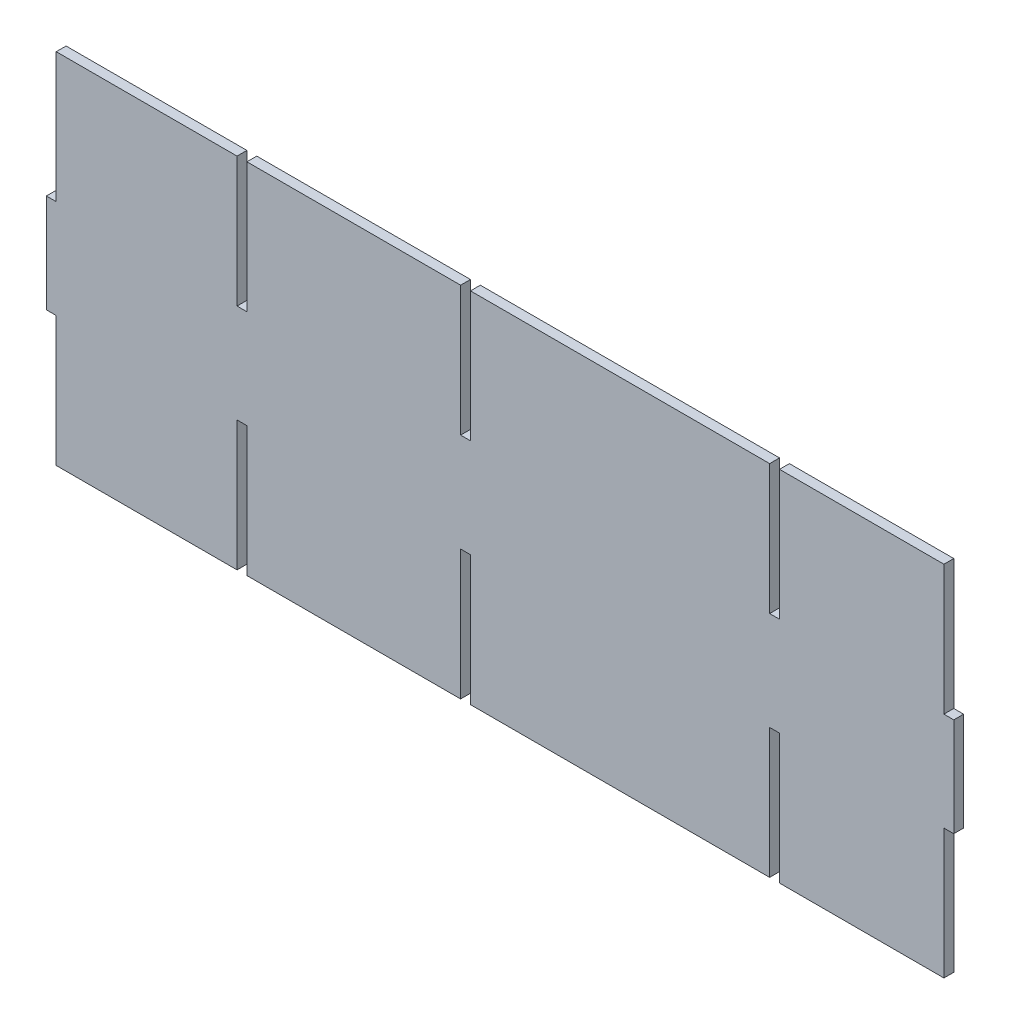
ISO-10303-21;
HEADER;
FILE_DESCRIPTION(('STEP AP214'),'2;1');
FILE_NAME('part.step','',(''),(''),'','','');
FILE_SCHEMA(('AUTOMOTIVE_DESIGN { 1 0 10303 214 1 1 1 1 }'));
ENDSEC;
DATA;
#1=APPLICATION_CONTEXT('core data for automotive mechanical design processes');
#2=APPLICATION_PROTOCOL_DEFINITION('international standard','automotive_design',2000,#1);
#3=PRODUCT_CONTEXT('',#1,'mechanical');
#4=PRODUCT('Part','Part','',(#3));
#5=PRODUCT_RELATED_PRODUCT_CATEGORY('part','',(#4));
#6=PRODUCT_DEFINITION_FORMATION('','',#4);
#7=PRODUCT_DEFINITION_CONTEXT('part definition',#1,'design');
#8=PRODUCT_DEFINITION('design','',#6,#7);
#9=PRODUCT_DEFINITION_SHAPE('','',#8);
#10=(LENGTH_UNIT() NAMED_UNIT(*) SI_UNIT(.MILLI.,.METRE.));
#11=(NAMED_UNIT(*) PLANE_ANGLE_UNIT() SI_UNIT($,.RADIAN.));
#12=(NAMED_UNIT(*) SI_UNIT($,.STERADIAN.) SOLID_ANGLE_UNIT());
#13=UNCERTAINTY_MEASURE_WITH_UNIT(LENGTH_MEASURE(1.E-05),#10,'distance_accuracy_value','');
#14=(GEOMETRIC_REPRESENTATION_CONTEXT(3) GLOBAL_UNCERTAINTY_ASSIGNED_CONTEXT((#13)) GLOBAL_UNIT_ASSIGNED_CONTEXT((#10,
#11,#12)) REPRESENTATION_CONTEXT('',''));
#15=CARTESIAN_POINT('',(0.,0.,0.));
#16=DIRECTION('',(0.,0.,1.));
#17=DIRECTION('',(1.,0.,0.));
#18=AXIS2_PLACEMENT_3D('',#15,#16,#17);
#19=CARTESIAN_POINT('',(0.,30.,3.));
#20=DIRECTION('',(1.,0.,0.));
#21=DIRECTION('',(0.,0.,-1.));
#22=AXIS2_PLACEMENT_3D('',#19,#20,#21);
#23=PLANE('',#22);
#24=DIRECTION('',(0.,-1.,0.));
#25=VECTOR('',#24,1.);
#26=CARTESIAN_POINT('',(0.,30.,0.));
#27=LINE('',#26,#25);
#28=CARTESIAN_POINT('',(0.,30.,0.));
#29=VERTEX_POINT('',#28);
#30=CARTESIAN_POINT('',(0.,0.,0.));
#31=VERTEX_POINT('',#30);
#32=EDGE_CURVE('E301',#29,#31,#27,.T.);
#33=ORIENTED_EDGE('',*,*,#32,.T.);
#34=DIRECTION('',(0.,0.,-1.));
#35=VECTOR('',#34,1.);
#36=CARTESIAN_POINT('',(0.,0.,3.));
#37=LINE('',#36,#35);
#38=CARTESIAN_POINT('',(0.,0.,3.));
#39=VERTEX_POINT('',#38);
#40=EDGE_CURVE('E11',#39,#31,#37,.T.);
#41=ORIENTED_EDGE('',*,*,#40,.F.);
#42=DIRECTION('',(0.,-1.,0.));
#43=VECTOR('',#42,1.);
#44=CARTESIAN_POINT('',(0.,30.,3.));
#45=LINE('',#44,#43);
#46=CARTESIAN_POINT('',(0.,30.,3.));
#47=VERTEX_POINT('',#46);
#48=EDGE_CURVE('E371',#47,#39,#45,.T.);
#49=ORIENTED_EDGE('',*,*,#48,.F.);
#50=DIRECTION('',(0.,0.,-1.));
#51=VECTOR('',#50,1.);
#52=CARTESIAN_POINT('',(0.,30.,3.));
#53=LINE('',#52,#51);
#54=EDGE_CURVE('E297',#47,#29,#53,.T.);
#55=ORIENTED_EDGE('',*,*,#54,.T.);
#56=EDGE_LOOP('',(#33,#41,#49,#55));
#57=FACE_BOUND('',#56,.T.);
#58=ADVANCED_FACE('F37',(#57),#23,.F.);
#59=CARTESIAN_POINT('',(0.,0.,3.));
#60=DIRECTION('',(0.,1.,0.));
#61=DIRECTION('',(0.,0.,1.));
#62=AXIS2_PLACEMENT_3D('',#59,#60,#61);
#63=PLANE('',#62);
#64=DIRECTION('',(1.,0.,0.));
#65=VECTOR('',#64,1.);
#66=CARTESIAN_POINT('',(0.,0.,0.));
#67=LINE('',#66,#65);
#68=CARTESIAN_POINT('',(3.,0.,0.));
#69=VERTEX_POINT('',#68);
#70=EDGE_CURVE('E304',#31,#69,#67,.T.);
#71=ORIENTED_EDGE('',*,*,#70,.T.);
#72=DIRECTION('',(0.,0.,-1.));
#73=VECTOR('',#72,1.);
#74=CARTESIAN_POINT('',(3.,0.,3.));
#75=LINE('',#74,#73);
#76=CARTESIAN_POINT('',(3.,0.,3.));
#77=VERTEX_POINT('',#76);
#78=EDGE_CURVE('E45',#77,#69,#75,.T.);
#79=ORIENTED_EDGE('',*,*,#78,.F.);
#80=DIRECTION('',(1.,0.,0.));
#81=VECTOR('',#80,1.);
#82=CARTESIAN_POINT('',(0.,0.,3.));
#83=LINE('',#82,#81);
#84=EDGE_CURVE('E180',#39,#77,#83,.T.);
#85=ORIENTED_EDGE('',*,*,#84,.F.);
#86=ORIENTED_EDGE('',*,*,#40,.T.);
#87=EDGE_LOOP('',(#71,#79,#85,#86));
#88=FACE_BOUND('',#87,.T.);
#89=ADVANCED_FACE('F569',(#88),#63,.F.);
#90=CARTESIAN_POINT('',(3.,0.,3.));
#91=DIRECTION('',(1.,0.,0.));
#92=DIRECTION('',(0.,1.,0.));
#93=AXIS2_PLACEMENT_3D('',#90,#91,#92);
#94=PLANE('',#93);
#95=DIRECTION('',(0.,-1.,0.));
#96=VECTOR('',#95,1.);
#97=CARTESIAN_POINT('',(3.,0.,0.));
#98=LINE('',#97,#96);
#99=CARTESIAN_POINT('',(3.00000000000001,-39.5,0.));
#100=VERTEX_POINT('',#99);
#101=EDGE_CURVE('E306',#69,#100,#98,.T.);
#102=ORIENTED_EDGE('',*,*,#101,.T.);
#103=DIRECTION('',(0.,0.,-1.));
#104=VECTOR('',#103,1.);
#105=CARTESIAN_POINT('',(3.00000000000001,-39.5,3.));
#106=LINE('',#105,#104);
#107=CARTESIAN_POINT('',(3.00000000000001,-39.5,3.));
#108=VERTEX_POINT('',#107);
#109=EDGE_CURVE('E462',#108,#100,#106,.T.);
#110=ORIENTED_EDGE('',*,*,#109,.F.);
#111=DIRECTION('',(0.,-1.,0.));
#112=VECTOR('',#111,1.);
#113=CARTESIAN_POINT('',(3.,0.,3.));
#114=LINE('',#113,#112);
#115=EDGE_CURVE('E470',#77,#108,#114,.T.);
#116=ORIENTED_EDGE('',*,*,#115,.F.);
#117=ORIENTED_EDGE('',*,*,#78,.T.);
#118=EDGE_LOOP('',(#102,#110,#116,#117));
#119=FACE_BOUND('',#118,.T.);
#120=ADVANCED_FACE('F468',(#119),#94,.F.);
#121=CARTESIAN_POINT('',(3.00000000000001,-39.5,3.));
#122=DIRECTION('',(0.,1.,0.));
#123=DIRECTION('',(0.,0.,1.));
#124=AXIS2_PLACEMENT_3D('',#121,#122,#123);
#125=PLANE('',#124);
#126=DIRECTION('',(1.,0.,0.));
#127=VECTOR('',#126,1.);
#128=CARTESIAN_POINT('',(3.00000000000001,-39.5,0.));
#129=LINE('',#128,#127);
#130=CARTESIAN_POINT('',(58.,-39.5,0.));
#131=VERTEX_POINT('',#130);
#132=EDGE_CURVE('E308',#100,#131,#129,.T.);
#133=ORIENTED_EDGE('',*,*,#132,.T.);
#134=DIRECTION('',(0.,0.,-1.));
#135=VECTOR('',#134,1.);
#136=CARTESIAN_POINT('',(58.,-39.5,3.));
#137=LINE('',#136,#135);
#138=CARTESIAN_POINT('',(58.,-39.5,3.));
#139=VERTEX_POINT('',#138);
#140=EDGE_CURVE('E459',#139,#131,#137,.T.);
#141=ORIENTED_EDGE('',*,*,#140,.F.);
#142=DIRECTION('',(1.,0.,0.));
#143=VECTOR('',#142,1.);
#144=CARTESIAN_POINT('',(3.00000000000001,-39.5,3.));
#145=LINE('',#144,#143);
#146=EDGE_CURVE('E488',#108,#139,#145,.T.);
#147=ORIENTED_EDGE('',*,*,#146,.F.);
#148=ORIENTED_EDGE('',*,*,#109,.T.);
#149=EDGE_LOOP('',(#133,#141,#147,#148));
#150=FACE_BOUND('',#149,.T.);
#151=ADVANCED_FACE('F479',(#150),#125,.F.);
#152=CARTESIAN_POINT('',(58.,-39.5,3.));
#153=DIRECTION('',(-1.,0.,0.));
#154=DIRECTION('',(0.,0.,1.));
#155=AXIS2_PLACEMENT_3D('',#152,#153,#154);
#156=PLANE('',#155);
#157=DIRECTION('',(0.,1.,0.));
#158=VECTOR('',#157,1.);
#159=CARTESIAN_POINT('',(58.,-39.5,0.));
#160=LINE('',#159,#158);
#161=CARTESIAN_POINT('',(58.,0.,0.));
#162=VERTEX_POINT('',#161);
#163=EDGE_CURVE('E310',#131,#162,#160,.T.);
#164=ORIENTED_EDGE('',*,*,#163,.T.);
#165=DIRECTION('',(0.,0.,-1.));
#166=VECTOR('',#165,1.);
#167=CARTESIAN_POINT('',(58.,0.,3.));
#168=LINE('',#167,#166);
#169=CARTESIAN_POINT('',(58.,0.,3.));
#170=VERTEX_POINT('',#169);
#171=EDGE_CURVE('E456',#170,#162,#168,.T.);
#172=ORIENTED_EDGE('',*,*,#171,.F.);
#173=DIRECTION('',(0.,1.,0.));
#174=VECTOR('',#173,1.);
#175=CARTESIAN_POINT('',(58.,-39.5,3.));
#176=LINE('',#175,#174);
#177=EDGE_CURVE('E485',#139,#170,#176,.T.);
#178=ORIENTED_EDGE('',*,*,#177,.F.);
#179=ORIENTED_EDGE('',*,*,#140,.T.);
#180=EDGE_LOOP('',(#164,#172,#178,#179));
#181=FACE_BOUND('',#180,.T.);
#182=ADVANCED_FACE('F483',(#181),#156,.F.);
#183=CARTESIAN_POINT('',(58.,0.,3.));
#184=DIRECTION('',(0.,1.,0.));
#185=DIRECTION('',(0.,0.,1.));
#186=AXIS2_PLACEMENT_3D('',#183,#184,#185);
#187=PLANE('',#186);
#188=DIRECTION('',(1.,0.,0.));
#189=VECTOR('',#188,1.);
#190=CARTESIAN_POINT('',(58.,0.,0.));
#191=LINE('',#190,#189);
#192=CARTESIAN_POINT('',(61.,0.,0.));
#193=VERTEX_POINT('',#192);
#194=EDGE_CURVE('E312',#162,#193,#191,.T.);
#195=ORIENTED_EDGE('',*,*,#194,.T.);
#196=DIRECTION('',(0.,0.,-1.));
#197=VECTOR('',#196,1.);
#198=CARTESIAN_POINT('',(61.,0.,3.));
#199=LINE('',#198,#197);
#200=CARTESIAN_POINT('',(61.,0.,3.));
#201=VERTEX_POINT('',#200);
#202=EDGE_CURVE('E453',#201,#193,#199,.T.);
#203=ORIENTED_EDGE('',*,*,#202,.F.);
#204=DIRECTION('',(1.,0.,0.));
#205=VECTOR('',#204,1.);
#206=CARTESIAN_POINT('',(58.,0.,3.));
#207=LINE('',#206,#205);
#208=EDGE_CURVE('E487',#170,#201,#207,.T.);
#209=ORIENTED_EDGE('',*,*,#208,.F.);
#210=ORIENTED_EDGE('',*,*,#171,.T.);
#211=EDGE_LOOP('',(#195,#203,#209,#210));
#212=FACE_BOUND('',#211,.T.);
#213=ADVANCED_FACE('F582',(#212),#187,.F.);
#214=CARTESIAN_POINT('',(61.,0.,3.));
#215=DIRECTION('',(1.,0.,0.));
#216=DIRECTION('',(0.,1.,0.));
#217=AXIS2_PLACEMENT_3D('',#214,#215,#216);
#218=PLANE('',#217);
#219=DIRECTION('',(0.,-1.,0.));
#220=VECTOR('',#219,1.);
#221=CARTESIAN_POINT('',(61.,0.,0.));
#222=LINE('',#221,#220);
#223=CARTESIAN_POINT('',(61.,-39.5,0.));
#224=VERTEX_POINT('',#223);
#225=EDGE_CURVE('E314',#193,#224,#222,.T.);
#226=ORIENTED_EDGE('',*,*,#225,.T.);
#227=DIRECTION('',(0.,0.,-1.));
#228=VECTOR('',#227,1.);
#229=CARTESIAN_POINT('',(61.,-39.5,3.));
#230=LINE('',#229,#228);
#231=CARTESIAN_POINT('',(61.,-39.5,3.));
#232=VERTEX_POINT('',#231);
#233=EDGE_CURVE('E450',#232,#224,#230,.T.);
#234=ORIENTED_EDGE('',*,*,#233,.F.);
#235=DIRECTION('',(0.,-1.,0.));
#236=VECTOR('',#235,1.);
#237=CARTESIAN_POINT('',(61.,0.,3.));
#238=LINE('',#237,#236);
#239=EDGE_CURVE('E490',#201,#232,#238,.T.);
#240=ORIENTED_EDGE('',*,*,#239,.F.);
#241=ORIENTED_EDGE('',*,*,#202,.T.);
#242=EDGE_LOOP('',(#226,#234,#240,#241));
#243=FACE_BOUND('',#242,.T.);
#244=ADVANCED_FACE('F585',(#243),#218,.F.);
#245=CARTESIAN_POINT('',(61.,-39.5,3.));
#246=DIRECTION('',(0.,1.,0.));
#247=DIRECTION('',(0.,0.,1.));
#248=AXIS2_PLACEMENT_3D('',#245,#246,#247);
#249=PLANE('',#248);
#250=DIRECTION('',(1.,0.,0.));
#251=VECTOR('',#250,1.);
#252=CARTESIAN_POINT('',(61.,-39.5,0.));
#253=LINE('',#252,#251);
#254=CARTESIAN_POINT('',(126.,-39.5,0.));
#255=VERTEX_POINT('',#254);
#256=EDGE_CURVE('E316',#224,#255,#253,.T.);
#257=ORIENTED_EDGE('',*,*,#256,.T.);
#258=DIRECTION('',(0.,0.,-1.));
#259=VECTOR('',#258,1.);
#260=CARTESIAN_POINT('',(126.,-39.5,3.));
#261=LINE('',#260,#259);
#262=CARTESIAN_POINT('',(126.,-39.5,3.));
#263=VERTEX_POINT('',#262);
#264=EDGE_CURVE('E447',#263,#255,#261,.T.);
#265=ORIENTED_EDGE('',*,*,#264,.F.);
#266=DIRECTION('',(1.,0.,0.));
#267=VECTOR('',#266,1.);
#268=CARTESIAN_POINT('',(61.,-39.5,3.));
#269=LINE('',#268,#267);
#270=EDGE_CURVE('E496',#232,#263,#269,.T.);
#271=ORIENTED_EDGE('',*,*,#270,.F.);
#272=ORIENTED_EDGE('',*,*,#233,.T.);
#273=EDGE_LOOP('',(#257,#265,#271,#272));
#274=FACE_BOUND('',#273,.T.);
#275=ADVANCED_FACE('F589',(#274),#249,.F.);
#276=CARTESIAN_POINT('',(126.,-39.5,3.));
#277=DIRECTION('',(-1.,0.,0.));
#278=DIRECTION('',(0.,0.,1.));
#279=AXIS2_PLACEMENT_3D('',#276,#277,#278);
#280=PLANE('',#279);
#281=DIRECTION('',(0.,1.,0.));
#282=VECTOR('',#281,1.);
#283=CARTESIAN_POINT('',(126.,-39.5,0.));
#284=LINE('',#283,#282);
#285=CARTESIAN_POINT('',(126.,0.,0.));
#286=VERTEX_POINT('',#285);
#287=EDGE_CURVE('E318',#255,#286,#284,.T.);
#288=ORIENTED_EDGE('',*,*,#287,.T.);
#289=DIRECTION('',(0.,0.,-1.));
#290=VECTOR('',#289,1.);
#291=CARTESIAN_POINT('',(126.,0.,3.));
#292=LINE('',#291,#290);
#293=CARTESIAN_POINT('',(126.,0.,3.));
#294=VERTEX_POINT('',#293);
#295=EDGE_CURVE('E444',#294,#286,#292,.T.);
#296=ORIENTED_EDGE('',*,*,#295,.F.);
#297=DIRECTION('',(0.,1.,0.));
#298=VECTOR('',#297,1.);
#299=CARTESIAN_POINT('',(126.,-39.5,3.));
#300=LINE('',#299,#298);
#301=EDGE_CURVE('E498',#263,#294,#300,.T.);
#302=ORIENTED_EDGE('',*,*,#301,.F.);
#303=ORIENTED_EDGE('',*,*,#264,.T.);
#304=EDGE_LOOP('',(#288,#296,#302,#303));
#305=FACE_BOUND('',#304,.T.);
#306=ADVANCED_FACE('F593',(#305),#280,.F.);
#307=CARTESIAN_POINT('',(126.,0.,3.));
#308=DIRECTION('',(0.,1.,0.));
#309=DIRECTION('',(0.,0.,1.));
#310=AXIS2_PLACEMENT_3D('',#307,#308,#309);
#311=PLANE('',#310);
#312=DIRECTION('',(1.,0.,0.));
#313=VECTOR('',#312,1.);
#314=CARTESIAN_POINT('',(126.,0.,0.));
#315=LINE('',#314,#313);
#316=CARTESIAN_POINT('',(129.,0.,0.));
#317=VERTEX_POINT('',#316);
#318=EDGE_CURVE('E320',#286,#317,#315,.T.);
#319=ORIENTED_EDGE('',*,*,#318,.T.);
#320=DIRECTION('',(0.,0.,-1.));
#321=VECTOR('',#320,1.);
#322=CARTESIAN_POINT('',(129.,0.,3.));
#323=LINE('',#322,#321);
#324=CARTESIAN_POINT('',(129.,0.,3.));
#325=VERTEX_POINT('',#324);
#326=EDGE_CURVE('E441',#325,#317,#323,.T.);
#327=ORIENTED_EDGE('',*,*,#326,.F.);
#328=DIRECTION('',(1.,0.,0.));
#329=VECTOR('',#328,1.);
#330=CARTESIAN_POINT('',(126.,0.,3.));
#331=LINE('',#330,#329);
#332=EDGE_CURVE('E500',#294,#325,#331,.T.);
#333=ORIENTED_EDGE('',*,*,#332,.F.);
#334=ORIENTED_EDGE('',*,*,#295,.T.);
#335=EDGE_LOOP('',(#319,#327,#333,#334));
#336=FACE_BOUND('',#335,.T.);
#337=ADVANCED_FACE('F597',(#336),#311,.F.);
#338=CARTESIAN_POINT('',(129.,0.,3.));
#339=DIRECTION('',(1.,0.,0.));
#340=DIRECTION('',(0.,0.,-1.));
#341=AXIS2_PLACEMENT_3D('',#338,#339,#340);
#342=PLANE('',#341);
#343=DIRECTION('',(0.,-1.,0.));
#344=VECTOR('',#343,1.);
#345=CARTESIAN_POINT('',(129.,0.,0.));
#346=LINE('',#345,#344);
#347=CARTESIAN_POINT('',(129.,-39.5,0.));
#348=VERTEX_POINT('',#347);
#349=EDGE_CURVE('E322',#317,#348,#346,.T.);
#350=ORIENTED_EDGE('',*,*,#349,.T.);
#351=DIRECTION('',(0.,0.,-1.));
#352=VECTOR('',#351,1.);
#353=CARTESIAN_POINT('',(129.,-39.5,3.));
#354=LINE('',#353,#352);
#355=CARTESIAN_POINT('',(129.,-39.5,3.));
#356=VERTEX_POINT('',#355);
#357=EDGE_CURVE('E438',#356,#348,#354,.T.);
#358=ORIENTED_EDGE('',*,*,#357,.F.);
#359=DIRECTION('',(0.,-1.,0.));
#360=VECTOR('',#359,1.);
#361=CARTESIAN_POINT('',(129.,0.,3.));
#362=LINE('',#361,#360);
#363=EDGE_CURVE('E502',#325,#356,#362,.T.);
#364=ORIENTED_EDGE('',*,*,#363,.F.);
#365=ORIENTED_EDGE('',*,*,#326,.T.);
#366=EDGE_LOOP('',(#350,#358,#364,#365));
#367=FACE_BOUND('',#366,.T.);
#368=ADVANCED_FACE('F601',(#367),#342,.F.);
#369=CARTESIAN_POINT('',(129.,-39.5,3.));
#370=DIRECTION('',(0.,1.,0.));
#371=DIRECTION('',(0.,0.,1.));
#372=AXIS2_PLACEMENT_3D('',#369,#370,#371);
#373=PLANE('',#372);
#374=DIRECTION('',(1.,0.,0.));
#375=VECTOR('',#374,1.);
#376=CARTESIAN_POINT('',(129.,-39.5,0.));
#377=LINE('',#376,#375);
#378=CARTESIAN_POINT('',(220.,-39.5,0.));
#379=VERTEX_POINT('',#378);
#380=EDGE_CURVE('E324',#348,#379,#377,.T.);
#381=ORIENTED_EDGE('',*,*,#380,.T.);
#382=DIRECTION('',(0.,0.,-1.));
#383=VECTOR('',#382,1.);
#384=CARTESIAN_POINT('',(220.,-39.5,3.));
#385=LINE('',#384,#383);
#386=CARTESIAN_POINT('',(220.,-39.5,3.));
#387=VERTEX_POINT('',#386);
#388=EDGE_CURVE('E435',#387,#379,#385,.T.);
#389=ORIENTED_EDGE('',*,*,#388,.F.);
#390=DIRECTION('',(1.,0.,0.));
#391=VECTOR('',#390,1.);
#392=CARTESIAN_POINT('',(129.,-39.5,3.));
#393=LINE('',#392,#391);
#394=EDGE_CURVE('E504',#356,#387,#393,.T.);
#395=ORIENTED_EDGE('',*,*,#394,.F.);
#396=ORIENTED_EDGE('',*,*,#357,.T.);
#397=EDGE_LOOP('',(#381,#389,#395,#396));
#398=FACE_BOUND('',#397,.T.);
#399=ADVANCED_FACE('F605',(#398),#373,.F.);
#400=CARTESIAN_POINT('',(220.,-39.5,3.));
#401=DIRECTION('',(-1.,0.,0.));
#402=DIRECTION('',(0.,0.,1.));
#403=AXIS2_PLACEMENT_3D('',#400,#401,#402);
#404=PLANE('',#403);
#405=DIRECTION('',(0.,1.,0.));
#406=VECTOR('',#405,1.);
#407=CARTESIAN_POINT('',(220.,-39.5,0.));
#408=LINE('',#407,#406);
#409=CARTESIAN_POINT('',(220.,0.,0.));
#410=VERTEX_POINT('',#409);
#411=EDGE_CURVE('E326',#379,#410,#408,.T.);
#412=ORIENTED_EDGE('',*,*,#411,.T.);
#413=DIRECTION('',(0.,0.,-1.));
#414=VECTOR('',#413,1.);
#415=CARTESIAN_POINT('',(220.,0.,3.));
#416=LINE('',#415,#414);
#417=CARTESIAN_POINT('',(220.,0.,3.));
#418=VERTEX_POINT('',#417);
#419=EDGE_CURVE('E432',#418,#410,#416,.T.);
#420=ORIENTED_EDGE('',*,*,#419,.F.);
#421=DIRECTION('',(0.,1.,0.));
#422=VECTOR('',#421,1.);
#423=CARTESIAN_POINT('',(220.,-39.5,3.));
#424=LINE('',#423,#422);
#425=EDGE_CURVE('E506',#387,#418,#424,.T.);
#426=ORIENTED_EDGE('',*,*,#425,.F.);
#427=ORIENTED_EDGE('',*,*,#388,.T.);
#428=EDGE_LOOP('',(#412,#420,#426,#427));
#429=FACE_BOUND('',#428,.T.);
#430=ADVANCED_FACE('F609',(#429),#404,.F.);
#431=CARTESIAN_POINT('',(220.,0.,3.));
#432=DIRECTION('',(0.,1.,0.));
#433=DIRECTION('',(0.,0.,1.));
#434=AXIS2_PLACEMENT_3D('',#431,#432,#433);
#435=PLANE('',#434);
#436=DIRECTION('',(1.,0.,0.));
#437=VECTOR('',#436,1.);
#438=CARTESIAN_POINT('',(220.,0.,0.));
#439=LINE('',#438,#437);
#440=CARTESIAN_POINT('',(223.,0.,0.));
#441=VERTEX_POINT('',#440);
#442=EDGE_CURVE('E328',#410,#441,#439,.T.);
#443=ORIENTED_EDGE('',*,*,#442,.T.);
#444=DIRECTION('',(0.,0.,-1.));
#445=VECTOR('',#444,1.);
#446=CARTESIAN_POINT('',(223.,0.,3.));
#447=LINE('',#446,#445);
#448=CARTESIAN_POINT('',(223.,0.,3.));
#449=VERTEX_POINT('',#448);
#450=EDGE_CURVE('E429',#449,#441,#447,.T.);
#451=ORIENTED_EDGE('',*,*,#450,.F.);
#452=DIRECTION('',(1.,0.,0.));
#453=VECTOR('',#452,1.);
#454=CARTESIAN_POINT('',(220.,0.,3.));
#455=LINE('',#454,#453);
#456=EDGE_CURVE('E508',#418,#449,#455,.T.);
#457=ORIENTED_EDGE('',*,*,#456,.F.);
#458=ORIENTED_EDGE('',*,*,#419,.T.);
#459=EDGE_LOOP('',(#443,#451,#457,#458));
#460=FACE_BOUND('',#459,.T.);
#461=ADVANCED_FACE('F613',(#460),#435,.F.);
#462=CARTESIAN_POINT('',(223.,0.,3.));
#463=DIRECTION('',(1.,0.,0.));
#464=DIRECTION('',(0.,0.,-1.));
#465=AXIS2_PLACEMENT_3D('',#462,#463,#464);
#466=PLANE('',#465);
#467=DIRECTION('',(0.,-1.,0.));
#468=VECTOR('',#467,1.);
#469=CARTESIAN_POINT('',(223.,0.,0.));
#470=LINE('',#469,#468);
#471=CARTESIAN_POINT('',(223.,-39.5,0.));
#472=VERTEX_POINT('',#471);
#473=EDGE_CURVE('E330',#441,#472,#470,.T.);
#474=ORIENTED_EDGE('',*,*,#473,.T.);
#475=DIRECTION('',(0.,0.,-1.));
#476=VECTOR('',#475,1.);
#477=CARTESIAN_POINT('',(223.,-39.5,3.));
#478=LINE('',#477,#476);
#479=CARTESIAN_POINT('',(223.,-39.5,3.));
#480=VERTEX_POINT('',#479);
#481=EDGE_CURVE('E426',#480,#472,#478,.T.);
#482=ORIENTED_EDGE('',*,*,#481,.F.);
#483=DIRECTION('',(0.,-1.,0.));
#484=VECTOR('',#483,1.);
#485=CARTESIAN_POINT('',(223.,0.,3.));
#486=LINE('',#485,#484);
#487=EDGE_CURVE('E510',#449,#480,#486,.T.);
#488=ORIENTED_EDGE('',*,*,#487,.F.);
#489=ORIENTED_EDGE('',*,*,#450,.T.);
#490=EDGE_LOOP('',(#474,#482,#488,#489));
#491=FACE_BOUND('',#490,.T.);
#492=ADVANCED_FACE('F617',(#491),#466,.F.);
#493=CARTESIAN_POINT('',(223.,-39.5,3.));
#494=DIRECTION('',(0.,1.,0.));
#495=DIRECTION('',(0.,0.,1.));
#496=AXIS2_PLACEMENT_3D('',#493,#494,#495);
#497=PLANE('',#496);
#498=DIRECTION('',(1.,0.,0.));
#499=VECTOR('',#498,1.);
#500=CARTESIAN_POINT('',(223.,-39.5,0.));
#501=LINE('',#500,#499);
#502=CARTESIAN_POINT('',(273.,-39.5,0.));
#503=VERTEX_POINT('',#502);
#504=EDGE_CURVE('E332',#472,#503,#501,.T.);
#505=ORIENTED_EDGE('',*,*,#504,.T.);
#506=DIRECTION('',(0.,0.,-1.));
#507=VECTOR('',#506,1.);
#508=CARTESIAN_POINT('',(273.,-39.5,3.));
#509=LINE('',#508,#507);
#510=CARTESIAN_POINT('',(273.,-39.5,3.));
#511=VERTEX_POINT('',#510);
#512=EDGE_CURVE('E423',#511,#503,#509,.T.);
#513=ORIENTED_EDGE('',*,*,#512,.F.);
#514=DIRECTION('',(1.,0.,0.));
#515=VECTOR('',#514,1.);
#516=CARTESIAN_POINT('',(223.,-39.5,3.));
#517=LINE('',#516,#515);
#518=EDGE_CURVE('E512',#480,#511,#517,.T.);
#519=ORIENTED_EDGE('',*,*,#518,.F.);
#520=ORIENTED_EDGE('',*,*,#481,.T.);
#521=EDGE_LOOP('',(#505,#513,#519,#520));
#522=FACE_BOUND('',#521,.T.);
#523=ADVANCED_FACE('F621',(#522),#497,.F.);
#524=CARTESIAN_POINT('',(273.,-39.5,3.));
#525=DIRECTION('',(-1.,0.,0.));
#526=DIRECTION('',(0.,0.,1.));
#527=AXIS2_PLACEMENT_3D('',#524,#525,#526);
#528=PLANE('',#527);
#529=DIRECTION('',(0.,1.,0.));
#530=VECTOR('',#529,1.);
#531=CARTESIAN_POINT('',(273.,-39.5,0.));
#532=LINE('',#531,#530);
#533=CARTESIAN_POINT('',(273.,0.,0.));
#534=VERTEX_POINT('',#533);
#535=EDGE_CURVE('E334',#503,#534,#532,.T.);
#536=ORIENTED_EDGE('',*,*,#535,.T.);
#537=DIRECTION('',(0.,0.,-1.));
#538=VECTOR('',#537,1.);
#539=CARTESIAN_POINT('',(273.,0.,3.));
#540=LINE('',#539,#538);
#541=CARTESIAN_POINT('',(273.,0.,3.));
#542=VERTEX_POINT('',#541);
#543=EDGE_CURVE('E420',#542,#534,#540,.T.);
#544=ORIENTED_EDGE('',*,*,#543,.F.);
#545=DIRECTION('',(0.,1.,0.));
#546=VECTOR('',#545,1.);
#547=CARTESIAN_POINT('',(273.,-39.5,3.));
#548=LINE('',#547,#546);
#549=EDGE_CURVE('E514',#511,#542,#548,.T.);
#550=ORIENTED_EDGE('',*,*,#549,.F.);
#551=ORIENTED_EDGE('',*,*,#512,.T.);
#552=EDGE_LOOP('',(#536,#544,#550,#551));
#553=FACE_BOUND('',#552,.T.);
#554=ADVANCED_FACE('F625',(#553),#528,.F.);
#555=CARTESIAN_POINT('',(273.,0.,3.));
#556=DIRECTION('',(0.,1.,0.));
#557=DIRECTION('',(0.,0.,1.));
#558=AXIS2_PLACEMENT_3D('',#555,#556,#557);
#559=PLANE('',#558);
#560=DIRECTION('',(1.,0.,0.));
#561=VECTOR('',#560,1.);
#562=CARTESIAN_POINT('',(273.,0.,0.));
#563=LINE('',#562,#561);
#564=CARTESIAN_POINT('',(276.,0.,0.));
#565=VERTEX_POINT('',#564);
#566=EDGE_CURVE('E336',#534,#565,#563,.T.);
#567=ORIENTED_EDGE('',*,*,#566,.T.);
#568=DIRECTION('',(0.,0.,-1.));
#569=VECTOR('',#568,1.);
#570=CARTESIAN_POINT('',(276.,0.,3.));
#571=LINE('',#570,#569);
#572=CARTESIAN_POINT('',(276.,0.,3.));
#573=VERTEX_POINT('',#572);
#574=EDGE_CURVE('E417',#573,#565,#571,.T.);
#575=ORIENTED_EDGE('',*,*,#574,.F.);
#576=DIRECTION('',(1.,0.,0.));
#577=VECTOR('',#576,1.);
#578=CARTESIAN_POINT('',(273.,0.,3.));
#579=LINE('',#578,#577);
#580=EDGE_CURVE('E516',#542,#573,#579,.T.);
#581=ORIENTED_EDGE('',*,*,#580,.F.);
#582=ORIENTED_EDGE('',*,*,#543,.T.);
#583=EDGE_LOOP('',(#567,#575,#581,#582));
#584=FACE_BOUND('',#583,.T.);
#585=ADVANCED_FACE('F629',(#584),#559,.F.);
#586=CARTESIAN_POINT('',(276.,0.,3.));
#587=DIRECTION('',(-1.,0.,0.));
#588=DIRECTION('',(0.,0.,1.));
#589=AXIS2_PLACEMENT_3D('',#586,#587,#588);
#590=PLANE('',#589);
#591=DIRECTION('',(0.,1.,0.));
#592=VECTOR('',#591,1.);
#593=CARTESIAN_POINT('',(276.,0.,0.));
#594=LINE('',#593,#592);
#595=CARTESIAN_POINT('',(276.,30.,0.));
#596=VERTEX_POINT('',#595);
#597=EDGE_CURVE('E338',#565,#596,#594,.T.);
#598=ORIENTED_EDGE('',*,*,#597,.T.);
#599=DIRECTION('',(0.,0.,-1.));
#600=VECTOR('',#599,1.);
#601=CARTESIAN_POINT('',(276.,30.,3.));
#602=LINE('',#601,#600);
#603=CARTESIAN_POINT('',(276.,30.,3.));
#604=VERTEX_POINT('',#603);
#605=EDGE_CURVE('E414',#604,#596,#602,.T.);
#606=ORIENTED_EDGE('',*,*,#605,.F.);
#607=DIRECTION('',(0.,1.,0.));
#608=VECTOR('',#607,1.);
#609=CARTESIAN_POINT('',(276.,0.,3.));
#610=LINE('',#609,#608);
#611=EDGE_CURVE('E518',#573,#604,#610,.T.);
#612=ORIENTED_EDGE('',*,*,#611,.F.);
#613=ORIENTED_EDGE('',*,*,#574,.T.);
#614=EDGE_LOOP('',(#598,#606,#612,#613));
#615=FACE_BOUND('',#614,.T.);
#616=ADVANCED_FACE('F633',(#615),#590,.F.);
#617=CARTESIAN_POINT('',(273.,30.,3.));
#618=DIRECTION('',(0.,-1.,0.));
#619=DIRECTION('',(0.,0.,-1.));
#620=AXIS2_PLACEMENT_3D('',#617,#618,#619);
#621=PLANE('',#620);
#622=DIRECTION('',(-1.,0.,0.));
#623=VECTOR('',#622,1.);
#624=CARTESIAN_POINT('',(273.,30.,0.));
#625=LINE('',#624,#623);
#626=CARTESIAN_POINT('',(273.,30.,0.));
#627=VERTEX_POINT('',#626);
#628=EDGE_CURVE('E340',#596,#627,#625,.T.);
#629=ORIENTED_EDGE('',*,*,#628,.T.);
#630=DIRECTION('',(0.,0.,-1.));
#631=VECTOR('',#630,1.);
#632=CARTESIAN_POINT('',(273.,30.,3.));
#633=LINE('',#632,#631);
#634=CARTESIAN_POINT('',(273.,30.,3.));
#635=VERTEX_POINT('',#634);
#636=EDGE_CURVE('E411',#635,#627,#633,.T.);
#637=ORIENTED_EDGE('',*,*,#636,.F.);
#638=DIRECTION('',(-1.,0.,0.));
#639=VECTOR('',#638,1.);
#640=CARTESIAN_POINT('',(273.,30.,3.));
#641=LINE('',#640,#639);
#642=EDGE_CURVE('E520',#604,#635,#641,.T.);
#643=ORIENTED_EDGE('',*,*,#642,.F.);
#644=ORIENTED_EDGE('',*,*,#605,.T.);
#645=EDGE_LOOP('',(#629,#637,#643,#644));
#646=FACE_BOUND('',#645,.T.);
#647=ADVANCED_FACE('F637',(#646),#621,.F.);
#648=CARTESIAN_POINT('',(273.,69.5000000000001,3.));
#649=DIRECTION('',(-1.,0.,0.));
#650=DIRECTION('',(0.,0.,1.));
#651=AXIS2_PLACEMENT_3D('',#648,#649,#650);
#652=PLANE('',#651);
#653=DIRECTION('',(0.,1.,0.));
#654=VECTOR('',#653,1.);
#655=CARTESIAN_POINT('',(273.,69.5000000000001,0.));
#656=LINE('',#655,#654);
#657=CARTESIAN_POINT('',(273.,69.5000000000001,0.));
#658=VERTEX_POINT('',#657);
#659=EDGE_CURVE('E342',#627,#658,#656,.T.);
#660=ORIENTED_EDGE('',*,*,#659,.T.);
#661=DIRECTION('',(0.,0.,-1.));
#662=VECTOR('',#661,1.);
#663=CARTESIAN_POINT('',(273.,69.5000000000001,3.));
#664=LINE('',#663,#662);
#665=CARTESIAN_POINT('',(273.,69.5000000000001,3.));
#666=VERTEX_POINT('',#665);
#667=EDGE_CURVE('E408',#666,#658,#664,.T.);
#668=ORIENTED_EDGE('',*,*,#667,.F.);
#669=DIRECTION('',(0.,1.,0.));
#670=VECTOR('',#669,1.);
#671=CARTESIAN_POINT('',(273.,69.5000000000001,3.));
#672=LINE('',#671,#670);
#673=EDGE_CURVE('E522',#635,#666,#672,.T.);
#674=ORIENTED_EDGE('',*,*,#673,.F.);
#675=ORIENTED_EDGE('',*,*,#636,.T.);
#676=EDGE_LOOP('',(#660,#668,#674,#675));
#677=FACE_BOUND('',#676,.T.);
#678=ADVANCED_FACE('F641',(#677),#652,.F.);
#679=CARTESIAN_POINT('',(223.,69.5000000000001,3.));
#680=DIRECTION('',(0.,-1.,0.));
#681=DIRECTION('',(0.,0.,-1.));
#682=AXIS2_PLACEMENT_3D('',#679,#680,#681);
#683=PLANE('',#682);
#684=DIRECTION('',(-1.,0.,0.));
#685=VECTOR('',#684,1.);
#686=CARTESIAN_POINT('',(223.,69.5000000000001,0.));
#687=LINE('',#686,#685);
#688=CARTESIAN_POINT('',(223.,69.5000000000001,0.));
#689=VERTEX_POINT('',#688);
#690=EDGE_CURVE('E344',#658,#689,#687,.T.);
#691=ORIENTED_EDGE('',*,*,#690,.T.);
#692=DIRECTION('',(0.,0.,-1.));
#693=VECTOR('',#692,1.);
#694=CARTESIAN_POINT('',(223.,69.5000000000001,3.));
#695=LINE('',#694,#693);
#696=CARTESIAN_POINT('',(223.,69.5000000000001,3.));
#697=VERTEX_POINT('',#696);
#698=EDGE_CURVE('E405',#697,#689,#695,.T.);
#699=ORIENTED_EDGE('',*,*,#698,.F.);
#700=DIRECTION('',(-1.,0.,0.));
#701=VECTOR('',#700,1.);
#702=CARTESIAN_POINT('',(223.,69.5000000000001,3.));
#703=LINE('',#702,#701);
#704=EDGE_CURVE('E524',#666,#697,#703,.T.);
#705=ORIENTED_EDGE('',*,*,#704,.F.);
#706=ORIENTED_EDGE('',*,*,#667,.T.);
#707=EDGE_LOOP('',(#691,#699,#705,#706));
#708=FACE_BOUND('',#707,.T.);
#709=ADVANCED_FACE('F645',(#708),#683,.F.);
#710=CARTESIAN_POINT('',(223.,30.0000000000001,3.));
#711=DIRECTION('',(1.,0.,0.));
#712=DIRECTION('',(0.,0.,-1.));
#713=AXIS2_PLACEMENT_3D('',#710,#711,#712);
#714=PLANE('',#713);
#715=DIRECTION('',(0.,-1.,0.));
#716=VECTOR('',#715,1.);
#717=CARTESIAN_POINT('',(223.,30.0000000000001,0.));
#718=LINE('',#717,#716);
#719=CARTESIAN_POINT('',(223.,30.0000000000001,0.));
#720=VERTEX_POINT('',#719);
#721=EDGE_CURVE('E346',#689,#720,#718,.T.);
#722=ORIENTED_EDGE('',*,*,#721,.T.);
#723=DIRECTION('',(0.,0.,-1.));
#724=VECTOR('',#723,1.);
#725=CARTESIAN_POINT('',(223.,30.0000000000001,3.));
#726=LINE('',#725,#724);
#727=CARTESIAN_POINT('',(223.,30.0000000000001,3.));
#728=VERTEX_POINT('',#727);
#729=EDGE_CURVE('E402',#728,#720,#726,.T.);
#730=ORIENTED_EDGE('',*,*,#729,.F.);
#731=DIRECTION('',(0.,-1.,0.));
#732=VECTOR('',#731,1.);
#733=CARTESIAN_POINT('',(223.,30.0000000000001,3.));
#734=LINE('',#733,#732);
#735=EDGE_CURVE('E526',#697,#728,#734,.T.);
#736=ORIENTED_EDGE('',*,*,#735,.F.);
#737=ORIENTED_EDGE('',*,*,#698,.T.);
#738=EDGE_LOOP('',(#722,#730,#736,#737));
#739=FACE_BOUND('',#738,.T.);
#740=ADVANCED_FACE('F649',(#739),#714,.F.);
#741=CARTESIAN_POINT('',(220.,30.,3.));
#742=DIRECTION('',(0.,-1.,0.));
#743=DIRECTION('',(1.,0.,0.));
#744=AXIS2_PLACEMENT_3D('',#741,#742,#743);
#745=PLANE('',#744);
#746=DIRECTION('',(-1.,0.,0.));
#747=VECTOR('',#746,1.);
#748=CARTESIAN_POINT('',(220.,30.,0.));
#749=LINE('',#748,#747);
#750=CARTESIAN_POINT('',(220.,30.,0.));
#751=VERTEX_POINT('',#750);
#752=EDGE_CURVE('E348',#720,#751,#749,.T.);
#753=ORIENTED_EDGE('',*,*,#752,.T.);
#754=DIRECTION('',(0.,0.,-1.));
#755=VECTOR('',#754,1.);
#756=CARTESIAN_POINT('',(220.,30.,3.));
#757=LINE('',#756,#755);
#758=CARTESIAN_POINT('',(220.,30.,3.));
#759=VERTEX_POINT('',#758);
#760=EDGE_CURVE('E399',#759,#751,#757,.T.);
#761=ORIENTED_EDGE('',*,*,#760,.F.);
#762=DIRECTION('',(-1.,0.,0.));
#763=VECTOR('',#762,1.);
#764=CARTESIAN_POINT('',(220.,30.,3.));
#765=LINE('',#764,#763);
#766=EDGE_CURVE('E528',#728,#759,#765,.T.);
#767=ORIENTED_EDGE('',*,*,#766,.F.);
#768=ORIENTED_EDGE('',*,*,#729,.T.);
#769=EDGE_LOOP('',(#753,#761,#767,#768));
#770=FACE_BOUND('',#769,.T.);
#771=ADVANCED_FACE('F653',(#770),#745,.F.);
#772=CARTESIAN_POINT('',(220.,69.5000000000001,3.));
#773=DIRECTION('',(-1.,0.,0.));
#774=DIRECTION('',(0.,0.,1.));
#775=AXIS2_PLACEMENT_3D('',#772,#773,#774);
#776=PLANE('',#775);
#777=DIRECTION('',(0.,1.,0.));
#778=VECTOR('',#777,1.);
#779=CARTESIAN_POINT('',(220.,69.5000000000001,0.));
#780=LINE('',#779,#778);
#781=CARTESIAN_POINT('',(220.,69.5000000000001,0.));
#782=VERTEX_POINT('',#781);
#783=EDGE_CURVE('E350',#751,#782,#780,.T.);
#784=ORIENTED_EDGE('',*,*,#783,.T.);
#785=DIRECTION('',(0.,0.,-1.));
#786=VECTOR('',#785,1.);
#787=CARTESIAN_POINT('',(220.,69.5000000000001,3.));
#788=LINE('',#787,#786);
#789=CARTESIAN_POINT('',(220.,69.5000000000001,3.));
#790=VERTEX_POINT('',#789);
#791=EDGE_CURVE('E396',#790,#782,#788,.T.);
#792=ORIENTED_EDGE('',*,*,#791,.F.);
#793=DIRECTION('',(0.,1.,0.));
#794=VECTOR('',#793,1.);
#795=CARTESIAN_POINT('',(220.,69.5000000000001,3.));
#796=LINE('',#795,#794);
#797=EDGE_CURVE('E530',#759,#790,#796,.T.);
#798=ORIENTED_EDGE('',*,*,#797,.F.);
#799=ORIENTED_EDGE('',*,*,#760,.T.);
#800=EDGE_LOOP('',(#784,#792,#798,#799));
#801=FACE_BOUND('',#800,.T.);
#802=ADVANCED_FACE('F657',(#801),#776,.F.);
#803=CARTESIAN_POINT('',(129.,69.5,3.));
#804=DIRECTION('',(0.,-1.,0.));
#805=DIRECTION('',(1.,0.,0.));
#806=AXIS2_PLACEMENT_3D('',#803,#804,#805);
#807=PLANE('',#806);
#808=DIRECTION('',(-1.,0.,0.));
#809=VECTOR('',#808,1.);
#810=CARTESIAN_POINT('',(129.,69.5,0.));
#811=LINE('',#810,#809);
#812=CARTESIAN_POINT('',(129.,69.5,0.));
#813=VERTEX_POINT('',#812);
#814=EDGE_CURVE('E352',#782,#813,#811,.T.);
#815=ORIENTED_EDGE('',*,*,#814,.T.);
#816=DIRECTION('',(0.,0.,-1.));
#817=VECTOR('',#816,1.);
#818=CARTESIAN_POINT('',(129.,69.5,3.));
#819=LINE('',#818,#817);
#820=CARTESIAN_POINT('',(129.,69.5,3.));
#821=VERTEX_POINT('',#820);
#822=EDGE_CURVE('E393',#821,#813,#819,.T.);
#823=ORIENTED_EDGE('',*,*,#822,.F.);
#824=DIRECTION('',(-1.,0.,0.));
#825=VECTOR('',#824,1.);
#826=CARTESIAN_POINT('',(129.,69.5,3.));
#827=LINE('',#826,#825);
#828=EDGE_CURVE('E532',#790,#821,#827,.T.);
#829=ORIENTED_EDGE('',*,*,#828,.F.);
#830=ORIENTED_EDGE('',*,*,#791,.T.);
#831=EDGE_LOOP('',(#815,#823,#829,#830));
#832=FACE_BOUND('',#831,.T.);
#833=ADVANCED_FACE('F661',(#832),#807,.F.);
#834=CARTESIAN_POINT('',(129.,30.,3.));
#835=DIRECTION('',(1.,0.,0.));
#836=DIRECTION('',(0.,0.,-1.));
#837=AXIS2_PLACEMENT_3D('',#834,#835,#836);
#838=PLANE('',#837);
#839=DIRECTION('',(0.,-1.,0.));
#840=VECTOR('',#839,1.);
#841=CARTESIAN_POINT('',(129.,30.,0.));
#842=LINE('',#841,#840);
#843=CARTESIAN_POINT('',(129.,30.,0.));
#844=VERTEX_POINT('',#843);
#845=EDGE_CURVE('E354',#813,#844,#842,.T.);
#846=ORIENTED_EDGE('',*,*,#845,.T.);
#847=DIRECTION('',(0.,0.,-1.));
#848=VECTOR('',#847,1.);
#849=CARTESIAN_POINT('',(129.,30.,3.));
#850=LINE('',#849,#848);
#851=CARTESIAN_POINT('',(129.,30.,3.));
#852=VERTEX_POINT('',#851);
#853=EDGE_CURVE('E390',#852,#844,#850,.T.);
#854=ORIENTED_EDGE('',*,*,#853,.F.);
#855=DIRECTION('',(0.,-1.,0.));
#856=VECTOR('',#855,1.);
#857=CARTESIAN_POINT('',(129.,30.,3.));
#858=LINE('',#857,#856);
#859=EDGE_CURVE('E534',#821,#852,#858,.T.);
#860=ORIENTED_EDGE('',*,*,#859,.F.);
#861=ORIENTED_EDGE('',*,*,#822,.T.);
#862=EDGE_LOOP('',(#846,#854,#860,#861));
#863=FACE_BOUND('',#862,.T.);
#864=ADVANCED_FACE('F665',(#863),#838,.F.);
#865=CARTESIAN_POINT('',(126.,30.,3.));
#866=DIRECTION('',(0.,-1.,0.));
#867=DIRECTION('',(1.,0.,0.));
#868=AXIS2_PLACEMENT_3D('',#865,#866,#867);
#869=PLANE('',#868);
#870=DIRECTION('',(-1.,0.,0.));
#871=VECTOR('',#870,1.);
#872=CARTESIAN_POINT('',(126.,30.,0.));
#873=LINE('',#872,#871);
#874=CARTESIAN_POINT('',(126.,30.,0.));
#875=VERTEX_POINT('',#874);
#876=EDGE_CURVE('E356',#844,#875,#873,.T.);
#877=ORIENTED_EDGE('',*,*,#876,.T.);
#878=DIRECTION('',(0.,0.,-1.));
#879=VECTOR('',#878,1.);
#880=CARTESIAN_POINT('',(126.,30.,3.));
#881=LINE('',#880,#879);
#882=CARTESIAN_POINT('',(126.,30.,3.));
#883=VERTEX_POINT('',#882);
#884=EDGE_CURVE('E387',#883,#875,#881,.T.);
#885=ORIENTED_EDGE('',*,*,#884,.F.);
#886=DIRECTION('',(-1.,0.,0.));
#887=VECTOR('',#886,1.);
#888=CARTESIAN_POINT('',(126.,30.,3.));
#889=LINE('',#888,#887);
#890=EDGE_CURVE('E536',#852,#883,#889,.T.);
#891=ORIENTED_EDGE('',*,*,#890,.F.);
#892=ORIENTED_EDGE('',*,*,#853,.T.);
#893=EDGE_LOOP('',(#877,#885,#891,#892));
#894=FACE_BOUND('',#893,.T.);
#895=ADVANCED_FACE('F669',(#894),#869,.F.);
#896=CARTESIAN_POINT('',(126.,69.5,3.));
#897=DIRECTION('',(-1.,0.,0.));
#898=DIRECTION('',(0.,0.,1.));
#899=AXIS2_PLACEMENT_3D('',#896,#897,#898);
#900=PLANE('',#899);
#901=DIRECTION('',(0.,1.,0.));
#902=VECTOR('',#901,1.);
#903=CARTESIAN_POINT('',(126.,69.5,0.));
#904=LINE('',#903,#902);
#905=CARTESIAN_POINT('',(126.,69.5,0.));
#906=VERTEX_POINT('',#905);
#907=EDGE_CURVE('E358',#875,#906,#904,.T.);
#908=ORIENTED_EDGE('',*,*,#907,.T.);
#909=DIRECTION('',(0.,0.,-1.));
#910=VECTOR('',#909,1.);
#911=CARTESIAN_POINT('',(126.,69.5,3.));
#912=LINE('',#911,#910);
#913=CARTESIAN_POINT('',(126.,69.5,3.));
#914=VERTEX_POINT('',#913);
#915=EDGE_CURVE('E384',#914,#906,#912,.T.);
#916=ORIENTED_EDGE('',*,*,#915,.F.);
#917=DIRECTION('',(0.,1.,0.));
#918=VECTOR('',#917,1.);
#919=CARTESIAN_POINT('',(126.,69.5,3.));
#920=LINE('',#919,#918);
#921=EDGE_CURVE('E538',#883,#914,#920,.T.);
#922=ORIENTED_EDGE('',*,*,#921,.F.);
#923=ORIENTED_EDGE('',*,*,#884,.T.);
#924=EDGE_LOOP('',(#908,#916,#922,#923));
#925=FACE_BOUND('',#924,.T.);
#926=ADVANCED_FACE('F673',(#925),#900,.F.);
#927=CARTESIAN_POINT('',(61.,69.5,3.));
#928=DIRECTION('',(0.,-1.,0.));
#929=DIRECTION('',(1.,0.,0.));
#930=AXIS2_PLACEMENT_3D('',#927,#928,#929);
#931=PLANE('',#930);
#932=DIRECTION('',(-1.,0.,0.));
#933=VECTOR('',#932,1.);
#934=CARTESIAN_POINT('',(61.,69.5,0.));
#935=LINE('',#934,#933);
#936=CARTESIAN_POINT('',(61.,69.5,0.));
#937=VERTEX_POINT('',#936);
#938=EDGE_CURVE('E360',#906,#937,#935,.T.);
#939=ORIENTED_EDGE('',*,*,#938,.T.);
#940=DIRECTION('',(0.,0.,-1.));
#941=VECTOR('',#940,1.);
#942=CARTESIAN_POINT('',(61.,69.5,3.));
#943=LINE('',#942,#941);
#944=CARTESIAN_POINT('',(61.,69.5,3.));
#945=VERTEX_POINT('',#944);
#946=EDGE_CURVE('E381',#945,#937,#943,.T.);
#947=ORIENTED_EDGE('',*,*,#946,.F.);
#948=DIRECTION('',(-1.,0.,0.));
#949=VECTOR('',#948,1.);
#950=CARTESIAN_POINT('',(61.,69.5,3.));
#951=LINE('',#950,#949);
#952=EDGE_CURVE('E540',#914,#945,#951,.T.);
#953=ORIENTED_EDGE('',*,*,#952,.F.);
#954=ORIENTED_EDGE('',*,*,#915,.T.);
#955=EDGE_LOOP('',(#939,#947,#953,#954));
#956=FACE_BOUND('',#955,.T.);
#957=ADVANCED_FACE('F677',(#956),#931,.F.);
#958=CARTESIAN_POINT('',(61.,30.,3.));
#959=DIRECTION('',(1.,0.,0.));
#960=DIRECTION('',(0.,1.,0.));
#961=AXIS2_PLACEMENT_3D('',#958,#959,#960);
#962=PLANE('',#961);
#963=DIRECTION('',(0.,-1.,0.));
#964=VECTOR('',#963,1.);
#965=CARTESIAN_POINT('',(61.,30.,0.));
#966=LINE('',#965,#964);
#967=CARTESIAN_POINT('',(61.,30.,0.));
#968=VERTEX_POINT('',#967);
#969=EDGE_CURVE('E362',#937,#968,#966,.T.);
#970=ORIENTED_EDGE('',*,*,#969,.T.);
#971=DIRECTION('',(0.,0.,-1.));
#972=VECTOR('',#971,1.);
#973=CARTESIAN_POINT('',(61.,30.,3.));
#974=LINE('',#973,#972);
#975=CARTESIAN_POINT('',(61.,30.,3.));
#976=VERTEX_POINT('',#975);
#977=EDGE_CURVE('E378',#976,#968,#974,.T.);
#978=ORIENTED_EDGE('',*,*,#977,.F.);
#979=DIRECTION('',(0.,-1.,0.));
#980=VECTOR('',#979,1.);
#981=CARTESIAN_POINT('',(61.,30.,3.));
#982=LINE('',#981,#980);
#983=EDGE_CURVE('E542',#945,#976,#982,.T.);
#984=ORIENTED_EDGE('',*,*,#983,.F.);
#985=ORIENTED_EDGE('',*,*,#946,.T.);
#986=EDGE_LOOP('',(#970,#978,#984,#985));
#987=FACE_BOUND('',#986,.T.);
#988=ADVANCED_FACE('F681',(#987),#962,.F.);
#989=CARTESIAN_POINT('',(58.,30.,3.));
#990=DIRECTION('',(0.,-1.,0.));
#991=DIRECTION('',(0.,0.,-1.));
#992=AXIS2_PLACEMENT_3D('',#989,#990,#991);
#993=PLANE('',#992);
#994=DIRECTION('',(-1.,0.,0.));
#995=VECTOR('',#994,1.);
#996=CARTESIAN_POINT('',(58.,30.,0.));
#997=LINE('',#996,#995);
#998=CARTESIAN_POINT('',(58.,30.,0.));
#999=VERTEX_POINT('',#998);
#1000=EDGE_CURVE('E364',#968,#999,#997,.T.);
#1001=ORIENTED_EDGE('',*,*,#1000,.T.);
#1002=DIRECTION('',(0.,0.,-1.));
#1003=VECTOR('',#1002,1.);
#1004=CARTESIAN_POINT('',(58.,30.,3.));
#1005=LINE('',#1004,#1003);
#1006=CARTESIAN_POINT('',(58.,30.,3.));
#1007=VERTEX_POINT('',#1006);
#1008=EDGE_CURVE('E375',#1007,#999,#1005,.T.);
#1009=ORIENTED_EDGE('',*,*,#1008,.F.);
#1010=DIRECTION('',(-1.,0.,0.));
#1011=VECTOR('',#1010,1.);
#1012=CARTESIAN_POINT('',(58.,30.,3.));
#1013=LINE('',#1012,#1011);
#1014=EDGE_CURVE('E544',#976,#1007,#1013,.T.);
#1015=ORIENTED_EDGE('',*,*,#1014,.F.);
#1016=ORIENTED_EDGE('',*,*,#977,.T.);
#1017=EDGE_LOOP('',(#1001,#1009,#1015,#1016));
#1018=FACE_BOUND('',#1017,.T.);
#1019=ADVANCED_FACE('F550',(#1018),#993,.F.);
#1020=CARTESIAN_POINT('',(58.,69.5,3.));
#1021=DIRECTION('',(-1.,0.,0.));
#1022=DIRECTION('',(0.,0.,1.));
#1023=AXIS2_PLACEMENT_3D('',#1020,#1021,#1022);
#1024=PLANE('',#1023);
#1025=DIRECTION('',(0.,1.,0.));
#1026=VECTOR('',#1025,1.);
#1027=CARTESIAN_POINT('',(58.,69.5,0.));
#1028=LINE('',#1027,#1026);
#1029=CARTESIAN_POINT('',(58.,69.5,0.));
#1030=VERTEX_POINT('',#1029);
#1031=EDGE_CURVE('E366',#999,#1030,#1028,.T.);
#1032=ORIENTED_EDGE('',*,*,#1031,.T.);
#1033=DIRECTION('',(0.,0.,-1.));
#1034=VECTOR('',#1033,1.);
#1035=CARTESIAN_POINT('',(58.,69.5,3.));
#1036=LINE('',#1035,#1034);
#1037=CARTESIAN_POINT('',(58.,69.5,3.));
#1038=VERTEX_POINT('',#1037);
#1039=EDGE_CURVE('E292',#1038,#1030,#1036,.T.);
#1040=ORIENTED_EDGE('',*,*,#1039,.F.);
#1041=DIRECTION('',(0.,1.,0.));
#1042=VECTOR('',#1041,1.);
#1043=CARTESIAN_POINT('',(58.,69.5,3.));
#1044=LINE('',#1043,#1042);
#1045=EDGE_CURVE('E283',#1007,#1038,#1044,.T.);
#1046=ORIENTED_EDGE('',*,*,#1045,.F.);
#1047=ORIENTED_EDGE('',*,*,#1008,.T.);
#1048=EDGE_LOOP('',(#1032,#1040,#1046,#1047));
#1049=FACE_BOUND('',#1048,.T.);
#1050=ADVANCED_FACE('F554',(#1049),#1024,.F.);
#1051=CARTESIAN_POINT('',(3.00000000000001,69.5,3.));
#1052=DIRECTION('',(0.,-1.,0.));
#1053=DIRECTION('',(0.,0.,-1.));
#1054=AXIS2_PLACEMENT_3D('',#1051,#1052,#1053);
#1055=PLANE('',#1054);
#1056=DIRECTION('',(-1.,0.,0.));
#1057=VECTOR('',#1056,1.);
#1058=CARTESIAN_POINT('',(3.00000000000001,69.5,0.));
#1059=LINE('',#1058,#1057);
#1060=CARTESIAN_POINT('',(3.00000000000001,69.5,0.));
#1061=VERTEX_POINT('',#1060);
#1062=EDGE_CURVE('E291',#1030,#1061,#1059,.T.);
#1063=ORIENTED_EDGE('',*,*,#1062,.T.);
#1064=DIRECTION('',(0.,0.,-1.));
#1065=VECTOR('',#1064,1.);
#1066=CARTESIAN_POINT('',(3.00000000000001,69.5,3.));
#1067=LINE('',#1066,#1065);
#1068=CARTESIAN_POINT('',(3.00000000000001,69.5,3.));
#1069=VERTEX_POINT('',#1068);
#1070=EDGE_CURVE('E288',#1069,#1061,#1067,.T.);
#1071=ORIENTED_EDGE('',*,*,#1070,.F.);
#1072=DIRECTION('',(-1.,0.,0.));
#1073=VECTOR('',#1072,1.);
#1074=CARTESIAN_POINT('',(3.00000000000001,69.5,3.));
#1075=LINE('',#1074,#1073);
#1076=EDGE_CURVE('E277',#1038,#1069,#1075,.T.);
#1077=ORIENTED_EDGE('',*,*,#1076,.F.);
#1078=ORIENTED_EDGE('',*,*,#1039,.T.);
#1079=EDGE_LOOP('',(#1063,#1071,#1077,#1078));
#1080=FACE_BOUND('',#1079,.T.);
#1081=ADVANCED_FACE('F289',(#1080),#1055,.F.);
#1082=CARTESIAN_POINT('',(3.,30.,3.));
#1083=DIRECTION('',(1.,0.,0.));
#1084=DIRECTION('',(0.,1.,0.));
#1085=AXIS2_PLACEMENT_3D('',#1082,#1083,#1084);
#1086=PLANE('',#1085);
#1087=DIRECTION('',(0.,-1.,0.));
#1088=VECTOR('',#1087,1.);
#1089=CARTESIAN_POINT('',(3.,30.,0.));
#1090=LINE('',#1089,#1088);
#1091=CARTESIAN_POINT('',(3.,30.,0.));
#1092=VERTEX_POINT('',#1091);
#1093=EDGE_CURVE('E166',#1061,#1092,#1090,.T.);
#1094=ORIENTED_EDGE('',*,*,#1093,.T.);
#1095=DIRECTION('',(0.,0.,-1.));
#1096=VECTOR('',#1095,1.);
#1097=CARTESIAN_POINT('',(3.,30.,3.));
#1098=LINE('',#1097,#1096);
#1099=CARTESIAN_POINT('',(3.,30.,3.));
#1100=VERTEX_POINT('',#1099);
#1101=EDGE_CURVE('E293',#1100,#1092,#1098,.T.);
#1102=ORIENTED_EDGE('',*,*,#1101,.F.);
#1103=DIRECTION('',(0.,-1.,0.));
#1104=VECTOR('',#1103,1.);
#1105=CARTESIAN_POINT('',(3.,30.,3.));
#1106=LINE('',#1105,#1104);
#1107=EDGE_CURVE('E281',#1069,#1100,#1106,.T.);
#1108=ORIENTED_EDGE('',*,*,#1107,.F.);
#1109=ORIENTED_EDGE('',*,*,#1070,.T.);
#1110=EDGE_LOOP('',(#1094,#1102,#1108,#1109));
#1111=FACE_BOUND('',#1110,.T.);
#1112=ADVANCED_FACE('F295',(#1111),#1086,.F.);
#1113=CARTESIAN_POINT('',(0.,30.,3.));
#1114=DIRECTION('',(0.,-1.,0.));
#1115=DIRECTION('',(0.,0.,-1.));
#1116=AXIS2_PLACEMENT_3D('',#1113,#1114,#1115);
#1117=PLANE('',#1116);
#1118=DIRECTION('',(-1.,0.,0.));
#1119=VECTOR('',#1118,1.);
#1120=CARTESIAN_POINT('',(0.,30.,0.));
#1121=LINE('',#1120,#1119);
#1122=EDGE_CURVE('E172',#1092,#29,#1121,.T.);
#1123=ORIENTED_EDGE('',*,*,#1122,.T.);
#1124=ORIENTED_EDGE('',*,*,#54,.F.);
#1125=DIRECTION('',(-1.,0.,0.));
#1126=VECTOR('',#1125,1.);
#1127=CARTESIAN_POINT('',(0.,30.,3.));
#1128=LINE('',#1127,#1126);
#1129=EDGE_CURVE('E53',#1100,#47,#1128,.T.);
#1130=ORIENTED_EDGE('',*,*,#1129,.F.);
#1131=ORIENTED_EDGE('',*,*,#1101,.T.);
#1132=EDGE_LOOP('',(#1123,#1124,#1130,#1131));
#1133=FACE_BOUND('',#1132,.T.);
#1134=ADVANCED_FACE('F558',(#1133),#1117,.F.);
#1135=CARTESIAN_POINT('',(0.,0.,3.));
#1136=DIRECTION('',(0.,0.,1.));
#1137=DIRECTION('',(1.,0.,0.));
#1138=AXIS2_PLACEMENT_3D('',#1135,#1136,#1137);
#1139=PLANE('',#1138);
#1140=ORIENTED_EDGE('',*,*,#48,.T.);
#1141=ORIENTED_EDGE('',*,*,#84,.T.);
#1142=ORIENTED_EDGE('',*,*,#115,.T.);
#1143=ORIENTED_EDGE('',*,*,#146,.T.);
#1144=ORIENTED_EDGE('',*,*,#177,.T.);
#1145=ORIENTED_EDGE('',*,*,#208,.T.);
#1146=ORIENTED_EDGE('',*,*,#239,.T.);
#1147=ORIENTED_EDGE('',*,*,#270,.T.);
#1148=ORIENTED_EDGE('',*,*,#301,.T.);
#1149=ORIENTED_EDGE('',*,*,#332,.T.);
#1150=ORIENTED_EDGE('',*,*,#363,.T.);
#1151=ORIENTED_EDGE('',*,*,#394,.T.);
#1152=ORIENTED_EDGE('',*,*,#425,.T.);
#1153=ORIENTED_EDGE('',*,*,#456,.T.);
#1154=ORIENTED_EDGE('',*,*,#487,.T.);
#1155=ORIENTED_EDGE('',*,*,#518,.T.);
#1156=ORIENTED_EDGE('',*,*,#549,.T.);
#1157=ORIENTED_EDGE('',*,*,#580,.T.);
#1158=ORIENTED_EDGE('',*,*,#611,.T.);
#1159=ORIENTED_EDGE('',*,*,#642,.T.);
#1160=ORIENTED_EDGE('',*,*,#673,.T.);
#1161=ORIENTED_EDGE('',*,*,#704,.T.);
#1162=ORIENTED_EDGE('',*,*,#735,.T.);
#1163=ORIENTED_EDGE('',*,*,#766,.T.);
#1164=ORIENTED_EDGE('',*,*,#797,.T.);
#1165=ORIENTED_EDGE('',*,*,#828,.T.);
#1166=ORIENTED_EDGE('',*,*,#859,.T.);
#1167=ORIENTED_EDGE('',*,*,#890,.T.);
#1168=ORIENTED_EDGE('',*,*,#921,.T.);
#1169=ORIENTED_EDGE('',*,*,#952,.T.);
#1170=ORIENTED_EDGE('',*,*,#983,.T.);
#1171=ORIENTED_EDGE('',*,*,#1014,.T.);
#1172=ORIENTED_EDGE('',*,*,#1045,.T.);
#1173=ORIENTED_EDGE('',*,*,#1076,.T.);
#1174=ORIENTED_EDGE('',*,*,#1107,.T.);
#1175=ORIENTED_EDGE('',*,*,#1129,.T.);
#1176=EDGE_LOOP('',(#1140,#1141,#1142,#1143,#1144,#1145,#1146,#1147,#1148,#1149,#1150,#1151,
#1152,#1153,#1154,#1155,#1156,#1157,#1158,#1159,#1160,#1161,#1162,#1163,#1164,#1165,#1166,#1167,
#1168,#1169,#1170,#1171,#1172,#1173,#1174,#1175));
#1177=FACE_BOUND('',#1176,.T.);
#1178=ADVANCED_FACE('F279',(#1177),#1139,.T.);
#1179=CARTESIAN_POINT('',(0.,0.,0.));
#1180=DIRECTION('',(0.,0.,1.));
#1181=DIRECTION('',(1.,0.,0.));
#1182=AXIS2_PLACEMENT_3D('',#1179,#1180,#1181);
#1183=PLANE('',#1182);
#1184=ORIENTED_EDGE('',*,*,#32,.F.);
#1185=ORIENTED_EDGE('',*,*,#1122,.F.);
#1186=ORIENTED_EDGE('',*,*,#1093,.F.);
#1187=ORIENTED_EDGE('',*,*,#1062,.F.);
#1188=ORIENTED_EDGE('',*,*,#1031,.F.);
#1189=ORIENTED_EDGE('',*,*,#1000,.F.);
#1190=ORIENTED_EDGE('',*,*,#969,.F.);
#1191=ORIENTED_EDGE('',*,*,#938,.F.);
#1192=ORIENTED_EDGE('',*,*,#907,.F.);
#1193=ORIENTED_EDGE('',*,*,#876,.F.);
#1194=ORIENTED_EDGE('',*,*,#845,.F.);
#1195=ORIENTED_EDGE('',*,*,#814,.F.);
#1196=ORIENTED_EDGE('',*,*,#783,.F.);
#1197=ORIENTED_EDGE('',*,*,#752,.F.);
#1198=ORIENTED_EDGE('',*,*,#721,.F.);
#1199=ORIENTED_EDGE('',*,*,#690,.F.);
#1200=ORIENTED_EDGE('',*,*,#659,.F.);
#1201=ORIENTED_EDGE('',*,*,#628,.F.);
#1202=ORIENTED_EDGE('',*,*,#597,.F.);
#1203=ORIENTED_EDGE('',*,*,#566,.F.);
#1204=ORIENTED_EDGE('',*,*,#535,.F.);
#1205=ORIENTED_EDGE('',*,*,#504,.F.);
#1206=ORIENTED_EDGE('',*,*,#473,.F.);
#1207=ORIENTED_EDGE('',*,*,#442,.F.);
#1208=ORIENTED_EDGE('',*,*,#411,.F.);
#1209=ORIENTED_EDGE('',*,*,#380,.F.);
#1210=ORIENTED_EDGE('',*,*,#349,.F.);
#1211=ORIENTED_EDGE('',*,*,#318,.F.);
#1212=ORIENTED_EDGE('',*,*,#287,.F.);
#1213=ORIENTED_EDGE('',*,*,#256,.F.);
#1214=ORIENTED_EDGE('',*,*,#225,.F.);
#1215=ORIENTED_EDGE('',*,*,#194,.F.);
#1216=ORIENTED_EDGE('',*,*,#163,.F.);
#1217=ORIENTED_EDGE('',*,*,#132,.F.);
#1218=ORIENTED_EDGE('',*,*,#101,.F.);
#1219=ORIENTED_EDGE('',*,*,#70,.F.);
#1220=EDGE_LOOP('',(#1184,#1185,#1186,#1187,#1188,#1189,#1190,#1191,#1192,#1193,#1194,#1195,
#1196,#1197,#1198,#1199,#1200,#1201,#1202,#1203,#1204,#1205,#1206,#1207,#1208,#1209,#1210,#1211,
#1212,#1213,#1214,#1215,#1216,#1217,#1218,#1219));
#1221=FACE_BOUND('',#1220,.T.);
#1222=ADVANCED_FACE('F474',(#1221),#1183,.F.);
#1223=CLOSED_SHELL('',(#58,#89,#120,#151,#182,#213,#244,#275,#306,#337,#368,#399,#430,#461,#492,
#523,#554,#585,#616,#647,#678,#709,#740,#771,#802,#833,#864,#895,#926,#957,#988,#1019,#1050,
#1081,#1112,#1134,#1178,#1222));
#1224=MANIFOLD_SOLID_BREP('B2',#1223);
#1225=ADVANCED_BREP_SHAPE_REPRESENTATION('',(#18,#1224),#14);
#1226=SHAPE_DEFINITION_REPRESENTATION(#9,#1225);
ENDSEC;
END-ISO-10303-21;
